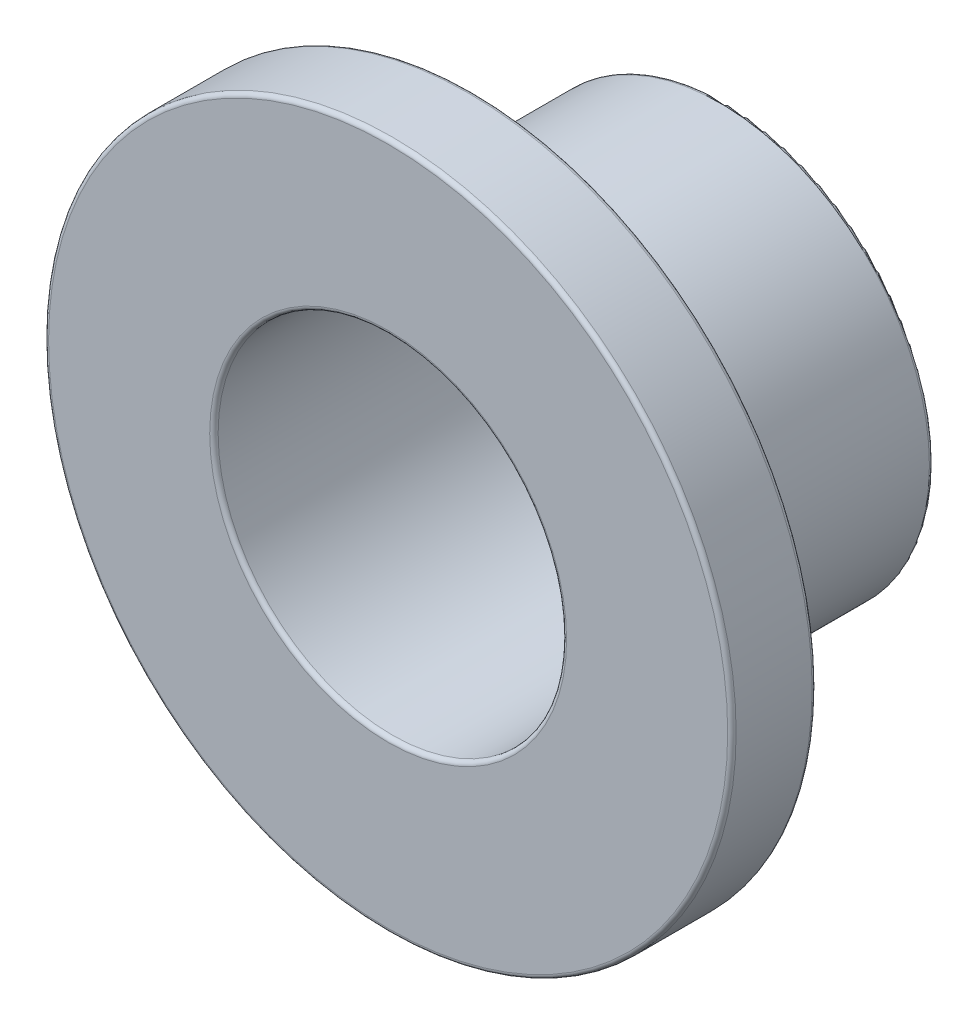
ISO-10303-21;
HEADER;
FILE_DESCRIPTION(('STEP AP214'),'2;1');
FILE_NAME('part.step','',(''),(''),'','','');
FILE_SCHEMA(('AUTOMOTIVE_DESIGN { 1 0 10303 214 1 1 1 1 }'));
ENDSEC;
DATA;
#1=APPLICATION_CONTEXT('core data for automotive mechanical design processes');
#2=APPLICATION_PROTOCOL_DEFINITION('international standard','automotive_design',2000,#1);
#3=PRODUCT_CONTEXT('',#1,'mechanical');
#4=PRODUCT('Part','Part','',(#3));
#5=PRODUCT_RELATED_PRODUCT_CATEGORY('part','',(#4));
#6=PRODUCT_DEFINITION_FORMATION('','',#4);
#7=PRODUCT_DEFINITION_CONTEXT('part definition',#1,'design');
#8=PRODUCT_DEFINITION('design','',#6,#7);
#9=PRODUCT_DEFINITION_SHAPE('','',#8);
#10=(LENGTH_UNIT() NAMED_UNIT(*) SI_UNIT(.MILLI.,.METRE.));
#11=(NAMED_UNIT(*) PLANE_ANGLE_UNIT() SI_UNIT($,.RADIAN.));
#12=(NAMED_UNIT(*) SI_UNIT($,.STERADIAN.) SOLID_ANGLE_UNIT());
#13=UNCERTAINTY_MEASURE_WITH_UNIT(LENGTH_MEASURE(1.E-05),#10,'distance_accuracy_value','');
#14=(GEOMETRIC_REPRESENTATION_CONTEXT(3) GLOBAL_UNCERTAINTY_ASSIGNED_CONTEXT((#13)) GLOBAL_UNIT_ASSIGNED_CONTEXT((#10,
#11,#12)) REPRESENTATION_CONTEXT('',''));
#15=CARTESIAN_POINT('',(0.,0.,0.));
#16=DIRECTION('',(0.,0.,1.));
#17=DIRECTION('',(1.,0.,0.));
#18=AXIS2_PLACEMENT_3D('',#15,#16,#17);
#19=CARTESIAN_POINT('',(0.,6.5151,3.1877));
#20=DIRECTION('',(0.,0.,-1.));
#21=DIRECTION('',(-1.,0.,0.));
#22=AXIS2_PLACEMENT_3D('',#19,#20,#21);
#23=PLANE('',#22);
#24=CARTESIAN_POINT('',(0.,0.,3.1877));
#25=DIRECTION('',(0.,0.,-1.));
#26=DIRECTION('',(-1.,0.,0.));
#27=AXIS2_PLACEMENT_3D('',#24,#25,#26);
#28=CIRCLE('',#27,3.38201);
#29=CARTESIAN_POINT('',(-3.38201,0.,3.1877));
#30=VERTEX_POINT('',#29);
#31=EDGE_CURVE('E88',#30,#30,#28,.T.);
#32=ORIENTED_EDGE('',*,*,#31,.T.);
#33=EDGE_LOOP('',(#32));
#34=FACE_BOUND('',#33,.T.);
#35=CARTESIAN_POINT('',(0.,0.,3.1877));
#36=DIRECTION('',(0.,0.,-1.));
#37=DIRECTION('',(-1.,0.,0.));
#38=AXIS2_PLACEMENT_3D('',#35,#36,#37);
#39=CIRCLE('',#38,6.43509);
#40=CARTESIAN_POINT('',(-6.43509,0.,3.1877));
#41=VERTEX_POINT('',#40);
#42=EDGE_CURVE('E92',#41,#41,#39,.F.);
#43=ORIENTED_EDGE('',*,*,#42,.T.);
#44=EDGE_LOOP('',(#43));
#45=FACE_BOUND('',#44,.T.);
#46=ADVANCED_FACE('F45',(#34,#45),#23,.F.);
#47=CARTESIAN_POINT('',(0.,0.,3.1877));
#48=DIRECTION('',(0.,0.,1.));
#49=DIRECTION('',(1.,0.,0.));
#50=AXIS2_PLACEMENT_3D('',#47,#48,#49);
#51=CYLINDRICAL_SURFACE('',#50,3.302);
#52=CARTESIAN_POINT('',(0.,0.,3.10769));
#53=DIRECTION('',(0.,0.,-1.));
#54=DIRECTION('',(-1.,0.,0.));
#55=AXIS2_PLACEMENT_3D('',#52,#53,#54);
#56=CIRCLE('',#55,3.302);
#57=CARTESIAN_POINT('',(-3.302,0.,3.10769));
#58=VERTEX_POINT('',#57);
#59=EDGE_CURVE('E95',#58,#58,#56,.F.);
#60=ORIENTED_EDGE('',*,*,#59,.T.);
#61=EDGE_LOOP('',(#60));
#62=FACE_BOUND('',#61,.T.);
#63=CARTESIAN_POINT('',(0.,0.,-3.10769));
#64=DIRECTION('',(0.,0.,1.));
#65=DIRECTION('',(1.,0.,0.));
#66=AXIS2_PLACEMENT_3D('',#63,#64,#65);
#67=CIRCLE('',#66,3.302);
#68=CARTESIAN_POINT('',(3.302,0.,-3.10769));
#69=VERTEX_POINT('',#68);
#70=EDGE_CURVE('E99',#69,#69,#67,.F.);
#71=ORIENTED_EDGE('',*,*,#70,.T.);
#72=EDGE_LOOP('',(#71));
#73=FACE_BOUND('',#72,.T.);
#74=ADVANCED_FACE('F105',(#62,#73),#51,.F.);
#75=CARTESIAN_POINT('',(0.,3.302,-3.1877));
#76=DIRECTION('',(0.,0.,1.));
#77=DIRECTION('',(1.,0.,0.));
#78=AXIS2_PLACEMENT_3D('',#75,#76,#77);
#79=PLANE('',#78);
#80=CARTESIAN_POINT('',(0.,0.,-3.1877));
#81=DIRECTION('',(0.,0.,1.));
#82=DIRECTION('',(1.,0.,0.));
#83=AXIS2_PLACEMENT_3D('',#80,#81,#82);
#84=CIRCLE('',#83,3.38201);
#85=CARTESIAN_POINT('',(3.38201,0.,-3.1877));
#86=VERTEX_POINT('',#85);
#87=EDGE_CURVE('E80',#86,#86,#84,.T.);
#88=ORIENTED_EDGE('',*,*,#87,.T.);
#89=EDGE_LOOP('',(#88));
#90=FACE_BOUND('',#89,.T.);
#91=CARTESIAN_POINT('',(0.,0.,-3.1877));
#92=DIRECTION('',(0.,0.,1.));
#93=DIRECTION('',(1.,0.,0.));
#94=AXIS2_PLACEMENT_3D('',#91,#92,#93);
#95=CIRCLE('',#94,3.88239);
#96=CARTESIAN_POINT('',(3.88239,0.,-3.1877));
#97=VERTEX_POINT('',#96);
#98=EDGE_CURVE('E84',#97,#97,#95,.F.);
#99=ORIENTED_EDGE('',*,*,#98,.T.);
#100=EDGE_LOOP('',(#99));
#101=FACE_BOUND('',#100,.T.);
#102=ADVANCED_FACE('F115',(#90,#101),#79,.F.);
#103=CARTESIAN_POINT('',(0.,0.,3.1877));
#104=DIRECTION('',(0.,0.,1.));
#105=DIRECTION('',(1.,0.,0.));
#106=AXIS2_PLACEMENT_3D('',#103,#104,#105);
#107=CYLINDRICAL_SURFACE('',#106,3.9624);
#108=CARTESIAN_POINT('',(0.,0.,-3.10769));
#109=DIRECTION('',(0.,0.,1.));
#110=DIRECTION('',(1.,0.,0.));
#111=AXIS2_PLACEMENT_3D('',#108,#109,#110);
#112=CIRCLE('',#111,3.9624);
#113=CARTESIAN_POINT('',(3.9624,0.,-3.10769));
#114=VERTEX_POINT('',#113);
#115=EDGE_CURVE('E73',#114,#114,#112,.T.);
#116=ORIENTED_EDGE('',*,*,#115,.T.);
#117=EDGE_LOOP('',(#116));
#118=FACE_BOUND('',#117,.T.);
#119=CARTESIAN_POINT('',(0.,0.,1.50749));
#120=DIRECTION('',(0.,0.,1.));
#121=DIRECTION('',(1.,0.,0.));
#122=AXIS2_PLACEMENT_3D('',#119,#120,#121);
#123=CIRCLE('',#122,3.9624);
#124=CARTESIAN_POINT('',(3.9624,0.,1.50749));
#125=VERTEX_POINT('',#124);
#126=EDGE_CURVE('E76',#125,#125,#123,.F.);
#127=ORIENTED_EDGE('',*,*,#126,.T.);
#128=EDGE_LOOP('',(#127));
#129=FACE_BOUND('',#128,.T.);
#130=ADVANCED_FACE('F118',(#118,#129),#107,.T.);
#131=CARTESIAN_POINT('',(0.,3.9624,1.5875));
#132=DIRECTION('',(0.,0.,1.));
#133=DIRECTION('',(1.,0.,0.));
#134=AXIS2_PLACEMENT_3D('',#131,#132,#133);
#135=PLANE('',#134);
#136=CARTESIAN_POINT('',(0.,0.,1.5875));
#137=DIRECTION('',(0.,0.,1.));
#138=DIRECTION('',(1.,0.,0.));
#139=AXIS2_PLACEMENT_3D('',#136,#137,#138);
#140=CIRCLE('',#139,4.04241);
#141=CARTESIAN_POINT('',(4.04241,0.,1.5875));
#142=VERTEX_POINT('',#141);
#143=EDGE_CURVE('E61',#142,#142,#140,.T.);
#144=ORIENTED_EDGE('',*,*,#143,.T.);
#145=EDGE_LOOP('',(#144));
#146=FACE_BOUND('',#145,.T.);
#147=CARTESIAN_POINT('',(0.,0.,1.5875));
#148=DIRECTION('',(0.,0.,1.));
#149=DIRECTION('',(1.,0.,0.));
#150=AXIS2_PLACEMENT_3D('',#147,#148,#149);
#151=CIRCLE('',#150,6.43509);
#152=CARTESIAN_POINT('',(6.43509,0.,1.5875));
#153=VERTEX_POINT('',#152);
#154=EDGE_CURVE('E68',#153,#153,#151,.F.);
#155=ORIENTED_EDGE('',*,*,#154,.T.);
#156=EDGE_LOOP('',(#155));
#157=FACE_BOUND('',#156,.T.);
#158=ADVANCED_FACE('F130',(#146,#157),#135,.F.);
#159=CARTESIAN_POINT('',(0.,0.,3.1877));
#160=DIRECTION('',(0.,0.,1.));
#161=DIRECTION('',(1.,0.,0.));
#162=AXIS2_PLACEMENT_3D('',#159,#160,#161);
#163=CYLINDRICAL_SURFACE('',#162,6.5151);
#164=CARTESIAN_POINT('',(0.,0.,1.66751));
#165=DIRECTION('',(0.,0.,1.));
#166=DIRECTION('',(1.,0.,0.));
#167=AXIS2_PLACEMENT_3D('',#164,#165,#166);
#168=CIRCLE('',#167,6.5151);
#169=CARTESIAN_POINT('',(6.5151,0.,1.66751));
#170=VERTEX_POINT('',#169);
#171=EDGE_CURVE('E10',#170,#170,#168,.T.);
#172=ORIENTED_EDGE('',*,*,#171,.T.);
#173=EDGE_LOOP('',(#172));
#174=FACE_BOUND('',#173,.T.);
#175=CARTESIAN_POINT('',(0.,0.,3.10769));
#176=DIRECTION('',(0.,0.,-1.));
#177=DIRECTION('',(-1.,0.,0.));
#178=AXIS2_PLACEMENT_3D('',#175,#176,#177);
#179=CIRCLE('',#178,6.5151);
#180=CARTESIAN_POINT('',(-6.5151,0.,3.10769));
#181=VERTEX_POINT('',#180);
#182=EDGE_CURVE('E53',#181,#181,#179,.T.);
#183=ORIENTED_EDGE('',*,*,#182,.T.);
#184=EDGE_LOOP('',(#183));
#185=FACE_BOUND('',#184,.T.);
#186=ADVANCED_FACE('F142',(#174,#185),#163,.T.);
#187=CARTESIAN_POINT('',(0.,0.,3.10769));
#188=DIRECTION('',(0.,0.,-1.));
#189=DIRECTION('',(-1.,0.,0.));
#190=AXIS2_PLACEMENT_3D('',#187,#188,#189);
#191=TOROIDAL_SURFACE('',#190,3.38201,0.08001);
#192=ORIENTED_EDGE('',*,*,#31,.F.);
#193=EDGE_LOOP('',(#192));
#194=FACE_BOUND('',#193,.T.);
#195=ORIENTED_EDGE('',*,*,#59,.F.);
#196=EDGE_LOOP('',(#195));
#197=FACE_BOUND('',#196,.T.);
#198=ADVANCED_FACE('F111',(#194,#197),#191,.T.);
#199=CARTESIAN_POINT('',(0.,0.,-3.10769));
#200=DIRECTION('',(0.,0.,1.));
#201=DIRECTION('',(1.,0.,0.));
#202=AXIS2_PLACEMENT_3D('',#199,#200,#201);
#203=TOROIDAL_SURFACE('',#202,3.38201,0.08001);
#204=ORIENTED_EDGE('',*,*,#70,.F.);
#205=EDGE_LOOP('',(#204));
#206=FACE_BOUND('',#205,.T.);
#207=ORIENTED_EDGE('',*,*,#87,.F.);
#208=EDGE_LOOP('',(#207));
#209=FACE_BOUND('',#208,.T.);
#210=ADVANCED_FACE('F107',(#206,#209),#203,.T.);
#211=CARTESIAN_POINT('',(0.,0.,-3.10769));
#212=DIRECTION('',(0.,0.,1.));
#213=DIRECTION('',(1.,0.,0.));
#214=AXIS2_PLACEMENT_3D('',#211,#212,#213);
#215=TOROIDAL_SURFACE('',#214,3.88239,0.08001);
#216=ORIENTED_EDGE('',*,*,#98,.F.);
#217=EDGE_LOOP('',(#216));
#218=FACE_BOUND('',#217,.T.);
#219=ORIENTED_EDGE('',*,*,#115,.F.);
#220=EDGE_LOOP('',(#219));
#221=FACE_BOUND('',#220,.T.);
#222=ADVANCED_FACE('F110',(#218,#221),#215,.T.);
#223=CARTESIAN_POINT('',(0.,0.,1.50749));
#224=DIRECTION('',(0.,0.,1.));
#225=DIRECTION('',(1.,0.,0.));
#226=AXIS2_PLACEMENT_3D('',#223,#224,#225);
#227=TOROIDAL_SURFACE('',#226,4.04241,0.08001);
#228=ORIENTED_EDGE('',*,*,#126,.F.);
#229=EDGE_LOOP('',(#228));
#230=FACE_BOUND('',#229,.T.);
#231=ORIENTED_EDGE('',*,*,#143,.F.);
#232=EDGE_LOOP('',(#231));
#233=FACE_BOUND('',#232,.T.);
#234=ADVANCED_FACE('F124',(#230,#233),#227,.F.);
#235=CARTESIAN_POINT('',(0.,0.,1.66751));
#236=DIRECTION('',(0.,0.,1.));
#237=DIRECTION('',(1.,0.,0.));
#238=AXIS2_PLACEMENT_3D('',#235,#236,#237);
#239=TOROIDAL_SURFACE('',#238,6.43509,0.08001);
#240=ORIENTED_EDGE('',*,*,#154,.F.);
#241=EDGE_LOOP('',(#240));
#242=FACE_BOUND('',#241,.T.);
#243=ORIENTED_EDGE('',*,*,#171,.F.);
#244=EDGE_LOOP('',(#243));
#245=FACE_BOUND('',#244,.T.);
#246=ADVANCED_FACE('F136',(#242,#245),#239,.T.);
#247=CARTESIAN_POINT('',(0.,0.,3.10769));
#248=DIRECTION('',(0.,0.,-1.));
#249=DIRECTION('',(-1.,0.,0.));
#250=AXIS2_PLACEMENT_3D('',#247,#248,#249);
#251=TOROIDAL_SURFACE('',#250,6.43509,0.08001);
#252=ORIENTED_EDGE('',*,*,#182,.F.);
#253=EDGE_LOOP('',(#252));
#254=FACE_BOUND('',#253,.T.);
#255=ORIENTED_EDGE('',*,*,#42,.F.);
#256=EDGE_LOOP('',(#255));
#257=FACE_BOUND('',#256,.T.);
#258=ADVANCED_FACE('F47',(#254,#257),#251,.T.);
#259=CLOSED_SHELL('',(#46,#74,#102,#130,#158,#186,#198,#210,#222,#234,#246,#258));
#260=MANIFOLD_SOLID_BREP('B2',#259);
#261=ADVANCED_BREP_SHAPE_REPRESENTATION('',(#18,#260),#14);
#262=SHAPE_DEFINITION_REPRESENTATION(#9,#261);
ENDSEC;
END-ISO-10303-21;
